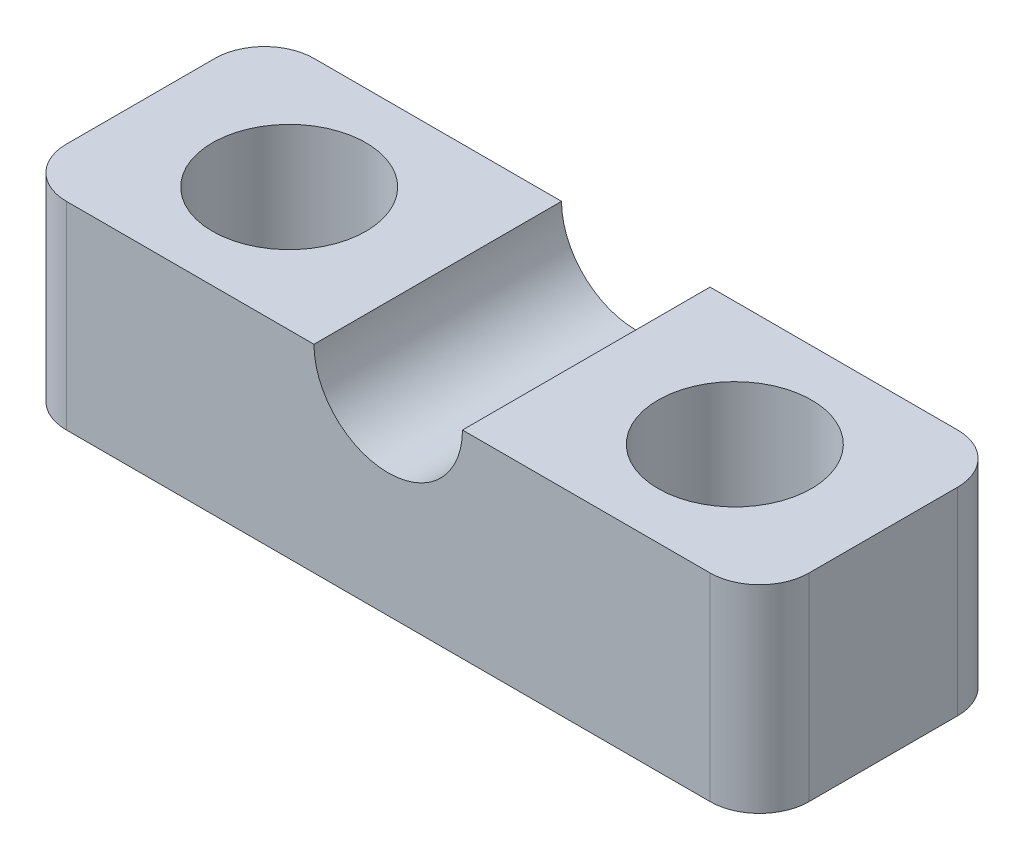
ISO-10303-21;
HEADER;
FILE_DESCRIPTION(('STEP AP214'),'2;1');
FILE_NAME('part.step','',(''),(''),'','','');
FILE_SCHEMA(('AUTOMOTIVE_DESIGN { 1 0 10303 214 1 1 1 1 }'));
ENDSEC;
DATA;
#1=APPLICATION_CONTEXT('core data for automotive mechanical design processes');
#2=APPLICATION_PROTOCOL_DEFINITION('international standard','automotive_design',2000,#1);
#3=PRODUCT_CONTEXT('',#1,'mechanical');
#4=PRODUCT('Part','Part','',(#3));
#5=PRODUCT_RELATED_PRODUCT_CATEGORY('part','',(#4));
#6=PRODUCT_DEFINITION_FORMATION('','',#4);
#7=PRODUCT_DEFINITION_CONTEXT('part definition',#1,'design');
#8=PRODUCT_DEFINITION('design','',#6,#7);
#9=PRODUCT_DEFINITION_SHAPE('','',#8);
#10=(LENGTH_UNIT() NAMED_UNIT(*) SI_UNIT(.MILLI.,.METRE.));
#11=(NAMED_UNIT(*) PLANE_ANGLE_UNIT() SI_UNIT($,.RADIAN.));
#12=(NAMED_UNIT(*) SI_UNIT($,.STERADIAN.) SOLID_ANGLE_UNIT());
#13=UNCERTAINTY_MEASURE_WITH_UNIT(LENGTH_MEASURE(1.E-05),#10,'distance_accuracy_value','');
#14=(GEOMETRIC_REPRESENTATION_CONTEXT(3) GLOBAL_UNCERTAINTY_ASSIGNED_CONTEXT((#13)) GLOBAL_UNIT_ASSIGNED_CONTEXT((#10,
#11,#12)) REPRESENTATION_CONTEXT('',''));
#15=CARTESIAN_POINT('',(0.,0.,0.));
#16=DIRECTION('',(0.,0.,1.));
#17=DIRECTION('',(1.,0.,0.));
#18=AXIS2_PLACEMENT_3D('',#15,#16,#17);
#19=CARTESIAN_POINT('',(0.,4.,0.));
#20=DIRECTION('',(0.,-1.,0.));
#21=DIRECTION('',(0.,0.,-1.));
#22=AXIS2_PLACEMENT_3D('',#19,#20,#21);
#23=PLANE('',#22);
#24=CARTESIAN_POINT('',(-1.64788732394367,4.,-0.352112676056339));
#25=DIRECTION('',(0.,1.,0.));
#26=DIRECTION('',(0.,0.,1.));
#27=AXIS2_PLACEMENT_3D('',#24,#25,#26);
#28=CIRCLE('',#27,1.55);
#29=CARTESIAN_POINT('',(-1.64788732394367,4.,1.19788732394366));
#30=VERTEX_POINT('',#29);
#31=EDGE_CURVE('E156',#30,#30,#28,.T.);
#32=ORIENTED_EDGE('',*,*,#31,.F.);
#33=EDGE_LOOP('',(#32));
#34=FACE_BOUND('',#33,.T.);
#35=DIRECTION('',(0.,0.,1.));
#36=VECTOR('',#35,1.);
#37=CARTESIAN_POINT('',(-4.64788732394367,4.,2.14788732394366));
#38=LINE('',#37,#36);
#39=CARTESIAN_POINT('',(-4.64788732394367,4.,-1.85211267605634));
#40=VERTEX_POINT('',#39);
#41=CARTESIAN_POINT('',(-4.64788732394367,4.,1.14788732394366));
#42=VERTEX_POINT('',#41);
#43=EDGE_CURVE('E162',#40,#42,#38,.T.);
#44=ORIENTED_EDGE('',*,*,#43,.T.);
#45=CARTESIAN_POINT('',(-3.64788732394367,4.,1.14788732394366));
#46=DIRECTION('',(0.,-1.,0.));
#47=DIRECTION('',(0.,0.,-1.));
#48=AXIS2_PLACEMENT_3D('',#45,#46,#47);
#49=CIRCLE('',#48,1.);
#50=CARTESIAN_POINT('',(-3.64788732394367,4.,2.14788732394366));
#51=VERTEX_POINT('',#50);
#52=EDGE_CURVE('E125',#42,#51,#49,.F.);
#53=ORIENTED_EDGE('',*,*,#52,.T.);
#54=DIRECTION('',(1.,0.,0.));
#55=VECTOR('',#54,1.);
#56=CARTESIAN_POINT('',(-4.64788732394367,4.,2.14788732394366));
#57=LINE('',#56,#55);
#58=CARTESIAN_POINT('',(1.35211267605633,4.,2.14788732394366));
#59=VERTEX_POINT('',#58);
#60=EDGE_CURVE('E118',#51,#59,#57,.T.);
#61=ORIENTED_EDGE('',*,*,#60,.T.);
#62=DIRECTION('',(0.,0.,-1.));
#63=VECTOR('',#62,1.);
#64=CARTESIAN_POINT('',(1.35211267605633,4.,2.14788732394366));
#65=LINE('',#64,#63);
#66=CARTESIAN_POINT('',(1.35211267605633,4.,-2.85211267605634));
#67=VERTEX_POINT('',#66);
#68=EDGE_CURVE('E122',#59,#67,#65,.T.);
#69=ORIENTED_EDGE('',*,*,#68,.T.);
#70=DIRECTION('',(-1.,0.,0.));
#71=VECTOR('',#70,1.);
#72=CARTESIAN_POINT('',(-4.64788732394367,4.,-2.85211267605634));
#73=LINE('',#72,#71);
#74=CARTESIAN_POINT('',(-3.64788732394367,4.,-2.85211267605634));
#75=VERTEX_POINT('',#74);
#76=EDGE_CURVE('E168',#67,#75,#73,.T.);
#77=ORIENTED_EDGE('',*,*,#76,.T.);
#78=CARTESIAN_POINT('',(-3.64788732394367,4.,-1.85211267605634));
#79=DIRECTION('',(0.,-1.,0.));
#80=DIRECTION('',(0.,0.,-1.));
#81=AXIS2_PLACEMENT_3D('',#78,#79,#80);
#82=CIRCLE('',#81,1.);
#83=EDGE_CURVE('E211',#75,#40,#82,.F.);
#84=ORIENTED_EDGE('',*,*,#83,.T.);
#85=EDGE_LOOP('',(#44,#53,#61,#69,#77,#84));
#86=FACE_BOUND('',#85,.T.);
#87=ADVANCED_FACE('F39',(#34,#86),#23,.F.);
#88=CARTESIAN_POINT('',(-4.64788732394367,4.,2.14788732394366));
#89=DIRECTION('',(1.,0.,0.));
#90=DIRECTION('',(0.,0.,-1.));
#91=AXIS2_PLACEMENT_3D('',#88,#89,#90);
#92=PLANE('',#91);
#93=DIRECTION('',(0.,0.,1.));
#94=VECTOR('',#93,1.);
#95=CARTESIAN_POINT('',(-4.64788732394367,0.,2.14788732394366));
#96=LINE('',#95,#94);
#97=CARTESIAN_POINT('',(-4.64788732394367,0.,-1.85211267605634));
#98=VERTEX_POINT('',#97);
#99=CARTESIAN_POINT('',(-4.64788732394367,0.,1.14788732394366));
#100=VERTEX_POINT('',#99);
#101=EDGE_CURVE('E153',#98,#100,#96,.T.);
#102=ORIENTED_EDGE('',*,*,#101,.T.);
#103=DIRECTION('',(0.,-1.,0.));
#104=VECTOR('',#103,1.);
#105=CARTESIAN_POINT('',(-4.64788732394367,4.,1.14788732394366));
#106=LINE('',#105,#104);
#107=EDGE_CURVE('E208',#100,#42,#106,.F.);
#108=ORIENTED_EDGE('',*,*,#107,.T.);
#109=ORIENTED_EDGE('',*,*,#43,.F.);
#110=DIRECTION('',(0.,-1.,0.));
#111=VECTOR('',#110,1.);
#112=CARTESIAN_POINT('',(-4.64788732394367,4.,-1.85211267605634));
#113=LINE('',#112,#111);
#114=EDGE_CURVE('E204',#40,#98,#113,.T.);
#115=ORIENTED_EDGE('',*,*,#114,.T.);
#116=EDGE_LOOP('',(#102,#108,#109,#115));
#117=FACE_BOUND('',#116,.T.);
#118=ADVANCED_FACE('F245',(#117),#92,.F.);
#119=CARTESIAN_POINT('',(-4.64788732394367,4.,2.14788732394366));
#120=DIRECTION('',(0.,0.,-1.));
#121=DIRECTION('',(-1.,0.,0.));
#122=AXIS2_PLACEMENT_3D('',#119,#120,#121);
#123=PLANE('',#122);
#124=ORIENTED_EDGE('',*,*,#60,.F.);
#125=DIRECTION('',(0.,-1.,0.));
#126=VECTOR('',#125,1.);
#127=CARTESIAN_POINT('',(-3.64788732394367,4.,2.14788732394366));
#128=LINE('',#127,#126);
#129=CARTESIAN_POINT('',(-3.64788732394367,0.,2.14788732394366));
#130=VERTEX_POINT('',#129);
#131=EDGE_CURVE('E189',#51,#130,#128,.T.);
#132=ORIENTED_EDGE('',*,*,#131,.T.);
#133=DIRECTION('',(1.,0.,0.));
#134=VECTOR('',#133,1.);
#135=CARTESIAN_POINT('',(-4.64788732394367,0.,2.14788732394366));
#136=LINE('',#135,#134);
#137=CARTESIAN_POINT('',(9.35211267605633,0.,2.14788732394366));
#138=VERTEX_POINT('',#137);
#139=EDGE_CURVE('E175',#130,#138,#136,.T.);
#140=ORIENTED_EDGE('',*,*,#139,.T.);
#141=DIRECTION('',(0.,-1.,0.));
#142=VECTOR('',#141,1.);
#143=CARTESIAN_POINT('',(9.35211267605633,4.,2.14788732394366));
#144=LINE('',#143,#142);
#145=CARTESIAN_POINT('',(9.35211267605633,4.,2.14788732394366));
#146=VERTEX_POINT('',#145);
#147=EDGE_CURVE('E142',#138,#146,#144,.F.);
#148=ORIENTED_EDGE('',*,*,#147,.T.);
#149=CARTESIAN_POINT('',(4.35211267605633,4.,2.14788732394366));
#150=VERTEX_POINT('',#149);
#151=EDGE_CURVE('E132',#150,#146,#57,.T.);
#152=ORIENTED_EDGE('',*,*,#151,.F.);
#153=CARTESIAN_POINT('',(2.85211267605633,4.,2.14788732394366));
#154=DIRECTION('',(0.,0.,-1.));
#155=DIRECTION('',(-1.,0.,0.));
#156=AXIS2_PLACEMENT_3D('',#153,#154,#155);
#157=CIRCLE('',#156,1.5);
#158=EDGE_CURVE('E137',#150,#59,#157,.T.);
#159=ORIENTED_EDGE('',*,*,#158,.T.);
#160=EDGE_LOOP('',(#124,#132,#140,#148,#152,#159));
#161=FACE_BOUND('',#160,.T.);
#162=ADVANCED_FACE('F146',(#161),#123,.F.);
#163=CARTESIAN_POINT('',(10.3521126760563,4.,2.14788732394366));
#164=DIRECTION('',(-1.,0.,0.));
#165=DIRECTION('',(0.,0.,1.));
#166=AXIS2_PLACEMENT_3D('',#163,#164,#165);
#167=PLANE('',#166);
#168=DIRECTION('',(0.,0.,-1.));
#169=VECTOR('',#168,1.);
#170=CARTESIAN_POINT('',(10.3521126760563,4.,2.14788732394366));
#171=LINE('',#170,#169);
#172=CARTESIAN_POINT('',(10.3521126760563,4.,1.14788732394366));
#173=VERTEX_POINT('',#172);
#174=CARTESIAN_POINT('',(10.3521126760563,4.,-1.85211267605634));
#175=VERTEX_POINT('',#174);
#176=EDGE_CURVE('E131',#173,#175,#171,.T.);
#177=ORIENTED_EDGE('',*,*,#176,.F.);
#178=DIRECTION('',(0.,-1.,0.));
#179=VECTOR('',#178,1.);
#180=CARTESIAN_POINT('',(10.3521126760563,4.,1.14788732394366));
#181=LINE('',#180,#179);
#182=CARTESIAN_POINT('',(10.3521126760563,0.,1.14788732394366));
#183=VERTEX_POINT('',#182);
#184=EDGE_CURVE('E218',#173,#183,#181,.T.);
#185=ORIENTED_EDGE('',*,*,#184,.T.);
#186=DIRECTION('',(0.,0.,-1.));
#187=VECTOR('',#186,1.);
#188=CARTESIAN_POINT('',(10.3521126760563,0.,2.14788732394366));
#189=LINE('',#188,#187);
#190=CARTESIAN_POINT('',(10.3521126760563,0.,-1.85211267605634));
#191=VERTEX_POINT('',#190);
#192=EDGE_CURVE('E179',#183,#191,#189,.T.);
#193=ORIENTED_EDGE('',*,*,#192,.T.);
#194=DIRECTION('',(0.,-1.,0.));
#195=VECTOR('',#194,1.);
#196=CARTESIAN_POINT('',(10.3521126760563,4.,-1.85211267605634));
#197=LINE('',#196,#195);
#198=EDGE_CURVE('E63',#191,#175,#197,.F.);
#199=ORIENTED_EDGE('',*,*,#198,.T.);
#200=EDGE_LOOP('',(#177,#185,#193,#199));
#201=FACE_BOUND('',#200,.T.);
#202=ADVANCED_FACE('F254',(#201),#167,.F.);
#203=CARTESIAN_POINT('',(-4.64788732394367,4.,-2.85211267605634));
#204=DIRECTION('',(0.,0.,1.));
#205=DIRECTION('',(1.,0.,0.));
#206=AXIS2_PLACEMENT_3D('',#203,#204,#205);
#207=PLANE('',#206);
#208=DIRECTION('',(-1.,0.,0.));
#209=VECTOR('',#208,1.);
#210=CARTESIAN_POINT('',(-4.64788732394367,0.,-2.85211267605634));
#211=LINE('',#210,#209);
#212=CARTESIAN_POINT('',(9.35211267605633,0.,-2.85211267605634));
#213=VERTEX_POINT('',#212);
#214=CARTESIAN_POINT('',(-3.64788732394367,0.,-2.85211267605634));
#215=VERTEX_POINT('',#214);
#216=EDGE_CURVE('E164',#213,#215,#211,.T.);
#217=ORIENTED_EDGE('',*,*,#216,.T.);
#218=DIRECTION('',(0.,-1.,0.));
#219=VECTOR('',#218,1.);
#220=CARTESIAN_POINT('',(-3.64788732394367,4.,-2.85211267605634));
#221=LINE('',#220,#219);
#222=EDGE_CURVE('E11',#215,#75,#221,.F.);
#223=ORIENTED_EDGE('',*,*,#222,.T.);
#224=ORIENTED_EDGE('',*,*,#76,.F.);
#225=CARTESIAN_POINT('',(2.85211267605633,4.,-2.85211267605634));
#226=DIRECTION('',(0.,0.,1.));
#227=DIRECTION('',(1.,0.,0.));
#228=AXIS2_PLACEMENT_3D('',#225,#226,#227);
#229=CIRCLE('',#228,1.5);
#230=CARTESIAN_POINT('',(4.35211267605633,4.,-2.85211267605634));
#231=VERTEX_POINT('',#230);
#232=EDGE_CURVE('E140',#67,#231,#229,.T.);
#233=ORIENTED_EDGE('',*,*,#232,.T.);
#234=CARTESIAN_POINT('',(9.35211267605633,4.,-2.85211267605634));
#235=VERTEX_POINT('',#234);
#236=EDGE_CURVE('E169',#235,#231,#73,.T.);
#237=ORIENTED_EDGE('',*,*,#236,.F.);
#238=DIRECTION('',(0.,-1.,0.));
#239=VECTOR('',#238,1.);
#240=CARTESIAN_POINT('',(9.35211267605633,4.,-2.85211267605634));
#241=LINE('',#240,#239);
#242=EDGE_CURVE('E48',#235,#213,#241,.T.);
#243=ORIENTED_EDGE('',*,*,#242,.T.);
#244=EDGE_LOOP('',(#217,#223,#224,#233,#237,#243));
#245=FACE_BOUND('',#244,.T.);
#246=ADVANCED_FACE('F231',(#245),#207,.F.);
#247=CARTESIAN_POINT('',(7.35211267605633,4.,-0.352112676056339));
#248=DIRECTION('',(0.,1.,0.));
#249=DIRECTION('',(0.,0.,1.));
#250=AXIS2_PLACEMENT_3D('',#247,#248,#249);
#251=CIRCLE('',#250,1.55);
#252=CARTESIAN_POINT('',(7.35211267605633,4.,1.19788732394366));
#253=VERTEX_POINT('',#252);
#254=EDGE_CURVE('E159',#253,#253,#251,.T.);
#255=ORIENTED_EDGE('',*,*,#254,.F.);
#256=EDGE_LOOP('',(#255));
#257=FACE_BOUND('',#256,.T.);
#258=ORIENTED_EDGE('',*,*,#151,.T.);
#259=CARTESIAN_POINT('',(9.35211267605633,4.,1.14788732394366));
#260=DIRECTION('',(0.,-1.,0.));
#261=DIRECTION('',(0.,0.,-1.));
#262=AXIS2_PLACEMENT_3D('',#259,#260,#261);
#263=CIRCLE('',#262,1.);
#264=EDGE_CURVE('E224',#146,#173,#263,.F.);
#265=ORIENTED_EDGE('',*,*,#264,.T.);
#266=ORIENTED_EDGE('',*,*,#176,.T.);
#267=CARTESIAN_POINT('',(9.35211267605633,4.,-1.85211267605634));
#268=DIRECTION('',(0.,-1.,0.));
#269=DIRECTION('',(0.,0.,-1.));
#270=AXIS2_PLACEMENT_3D('',#267,#268,#269);
#271=CIRCLE('',#270,1.);
#272=EDGE_CURVE('E55',#175,#235,#271,.F.);
#273=ORIENTED_EDGE('',*,*,#272,.T.);
#274=ORIENTED_EDGE('',*,*,#236,.T.);
#275=DIRECTION('',(0.,0.,-1.));
#276=VECTOR('',#275,1.);
#277=CARTESIAN_POINT('',(4.35211267605633,4.,2.14788732394366));
#278=LINE('',#277,#276);
#279=EDGE_CURVE('E143',#231,#150,#278,.F.);
#280=ORIENTED_EDGE('',*,*,#279,.T.);
#281=EDGE_LOOP('',(#258,#265,#266,#273,#274,#280));
#282=FACE_BOUND('',#281,.T.);
#283=ADVANCED_FACE('F255',(#257,#282),#23,.F.);
#284=CARTESIAN_POINT('',(0.,0.,0.));
#285=DIRECTION('',(0.,-1.,0.));
#286=DIRECTION('',(0.,0.,-1.));
#287=AXIS2_PLACEMENT_3D('',#284,#285,#286);
#288=PLANE('',#287);
#289=CARTESIAN_POINT('',(-1.64788732394367,0.,-0.352112676056339));
#290=DIRECTION('',(0.,1.,0.));
#291=DIRECTION('',(0.,0.,1.));
#292=AXIS2_PLACEMENT_3D('',#289,#290,#291);
#293=CIRCLE('',#292,1.55);
#294=CARTESIAN_POINT('',(-1.64788732394367,0.,1.19788732394366));
#295=VERTEX_POINT('',#294);
#296=EDGE_CURVE('E149',#295,#295,#293,.T.);
#297=ORIENTED_EDGE('',*,*,#296,.T.);
#298=EDGE_LOOP('',(#297));
#299=FACE_BOUND('',#298,.T.);
#300=CARTESIAN_POINT('',(7.35211267605633,0.,-0.352112676056339));
#301=DIRECTION('',(0.,1.,0.));
#302=DIRECTION('',(0.,0.,1.));
#303=AXIS2_PLACEMENT_3D('',#300,#301,#302);
#304=CIRCLE('',#303,1.55);
#305=CARTESIAN_POINT('',(7.35211267605633,0.,1.19788732394366));
#306=VERTEX_POINT('',#305);
#307=EDGE_CURVE('E282',#306,#306,#304,.T.);
#308=ORIENTED_EDGE('',*,*,#307,.T.);
#309=EDGE_LOOP('',(#308));
#310=FACE_BOUND('',#309,.T.);
#311=ORIENTED_EDGE('',*,*,#139,.F.);
#312=CARTESIAN_POINT('',(-3.64788732394367,0.,1.14788732394366));
#313=DIRECTION('',(0.,-1.,0.));
#314=DIRECTION('',(0.,0.,-1.));
#315=AXIS2_PLACEMENT_3D('',#312,#313,#314);
#316=CIRCLE('',#315,1.);
#317=EDGE_CURVE('E201',#130,#100,#316,.T.);
#318=ORIENTED_EDGE('',*,*,#317,.T.);
#319=ORIENTED_EDGE('',*,*,#101,.F.);
#320=CARTESIAN_POINT('',(-3.64788732394367,0.,-1.85211267605634));
#321=DIRECTION('',(0.,-1.,0.));
#322=DIRECTION('',(0.,0.,-1.));
#323=AXIS2_PLACEMENT_3D('',#320,#321,#322);
#324=CIRCLE('',#323,1.);
#325=EDGE_CURVE('E195',#98,#215,#324,.T.);
#326=ORIENTED_EDGE('',*,*,#325,.T.);
#327=ORIENTED_EDGE('',*,*,#216,.F.);
#328=CARTESIAN_POINT('',(9.35211267605633,0.,-1.85211267605634));
#329=DIRECTION('',(0.,-1.,0.));
#330=DIRECTION('',(0.,0.,-1.));
#331=AXIS2_PLACEMENT_3D('',#328,#329,#330);
#332=CIRCLE('',#331,1.);
#333=EDGE_CURVE('E192',#213,#191,#332,.T.);
#334=ORIENTED_EDGE('',*,*,#333,.T.);
#335=ORIENTED_EDGE('',*,*,#192,.F.);
#336=CARTESIAN_POINT('',(9.35211267605633,0.,1.14788732394366));
#337=DIRECTION('',(0.,-1.,0.));
#338=DIRECTION('',(0.,0.,-1.));
#339=AXIS2_PLACEMENT_3D('',#336,#337,#338);
#340=CIRCLE('',#339,1.);
#341=EDGE_CURVE('E198',#183,#138,#340,.T.);
#342=ORIENTED_EDGE('',*,*,#341,.T.);
#343=EDGE_LOOP('',(#311,#318,#319,#326,#327,#334,#335,#342));
#344=FACE_BOUND('',#343,.T.);
#345=ADVANCED_FACE('F236',(#299,#310,#344),#288,.T.);
#346=CARTESIAN_POINT('',(2.85211267605633,4.,2.14788732394366));
#347=DIRECTION('',(0.,0.,-1.));
#348=DIRECTION('',(-1.,0.,0.));
#349=AXIS2_PLACEMENT_3D('',#346,#347,#348);
#350=CYLINDRICAL_SURFACE('',#349,1.5);
#351=ORIENTED_EDGE('',*,*,#158,.F.);
#352=ORIENTED_EDGE('',*,*,#279,.F.);
#353=ORIENTED_EDGE('',*,*,#232,.F.);
#354=ORIENTED_EDGE('',*,*,#68,.F.);
#355=EDGE_LOOP('',(#351,#352,#353,#354));
#356=FACE_BOUND('',#355,.T.);
#357=ADVANCED_FACE('F135',(#356),#350,.F.);
#358=CARTESIAN_POINT('',(7.35211267605633,0.,-0.352112676056339));
#359=DIRECTION('',(0.,1.,0.));
#360=DIRECTION('',(0.,0.,1.));
#361=AXIS2_PLACEMENT_3D('',#358,#359,#360);
#362=CYLINDRICAL_SURFACE('',#361,1.55);
#363=ORIENTED_EDGE('',*,*,#307,.F.);
#364=EDGE_LOOP('',(#363));
#365=FACE_BOUND('',#364,.T.);
#366=ORIENTED_EDGE('',*,*,#254,.T.);
#367=EDGE_LOOP('',(#366));
#368=FACE_BOUND('',#367,.T.);
#369=ADVANCED_FACE('F293',(#365,#368),#362,.F.);
#370=CARTESIAN_POINT('',(-1.64788732394367,0.,-0.352112676056339));
#371=DIRECTION('',(0.,1.,0.));
#372=DIRECTION('',(0.,0.,1.));
#373=AXIS2_PLACEMENT_3D('',#370,#371,#372);
#374=CYLINDRICAL_SURFACE('',#373,1.55);
#375=ORIENTED_EDGE('',*,*,#296,.F.);
#376=EDGE_LOOP('',(#375));
#377=FACE_BOUND('',#376,.T.);
#378=ORIENTED_EDGE('',*,*,#31,.T.);
#379=EDGE_LOOP('',(#378));
#380=FACE_BOUND('',#379,.T.);
#381=ADVANCED_FACE('F291',(#377,#380),#374,.F.);
#382=CARTESIAN_POINT('',(-3.64788732394367,4.,1.14788732394366));
#383=DIRECTION('',(0.,-1.,0.));
#384=DIRECTION('',(0.,0.,-1.));
#385=AXIS2_PLACEMENT_3D('',#382,#383,#384);
#386=CYLINDRICAL_SURFACE('',#385,1.);
#387=ORIENTED_EDGE('',*,*,#52,.F.);
#388=ORIENTED_EDGE('',*,*,#107,.F.);
#389=ORIENTED_EDGE('',*,*,#317,.F.);
#390=ORIENTED_EDGE('',*,*,#131,.F.);
#391=EDGE_LOOP('',(#387,#388,#389,#390));
#392=FACE_BOUND('',#391,.T.);
#393=ADVANCED_FACE('F248',(#392),#386,.T.);
#394=CARTESIAN_POINT('',(9.35211267605633,4.,1.14788732394366));
#395=DIRECTION('',(0.,-1.,0.));
#396=DIRECTION('',(0.,0.,-1.));
#397=AXIS2_PLACEMENT_3D('',#394,#395,#396);
#398=CYLINDRICAL_SURFACE('',#397,1.);
#399=ORIENTED_EDGE('',*,*,#264,.F.);
#400=ORIENTED_EDGE('',*,*,#147,.F.);
#401=ORIENTED_EDGE('',*,*,#341,.F.);
#402=ORIENTED_EDGE('',*,*,#184,.F.);
#403=EDGE_LOOP('',(#399,#400,#401,#402));
#404=FACE_BOUND('',#403,.T.);
#405=ADVANCED_FACE('F253',(#404),#398,.T.);
#406=CARTESIAN_POINT('',(-3.64788732394367,4.,-1.85211267605634));
#407=DIRECTION('',(0.,-1.,0.));
#408=DIRECTION('',(0.,0.,-1.));
#409=AXIS2_PLACEMENT_3D('',#406,#407,#408);
#410=CYLINDRICAL_SURFACE('',#409,1.);
#411=ORIENTED_EDGE('',*,*,#83,.F.);
#412=ORIENTED_EDGE('',*,*,#222,.F.);
#413=ORIENTED_EDGE('',*,*,#325,.F.);
#414=ORIENTED_EDGE('',*,*,#114,.F.);
#415=EDGE_LOOP('',(#411,#412,#413,#414));
#416=FACE_BOUND('',#415,.T.);
#417=ADVANCED_FACE('F242',(#416),#410,.T.);
#418=CARTESIAN_POINT('',(9.35211267605633,4.,-1.85211267605634));
#419=DIRECTION('',(0.,-1.,0.));
#420=DIRECTION('',(0.,0.,-1.));
#421=AXIS2_PLACEMENT_3D('',#418,#419,#420);
#422=CYLINDRICAL_SURFACE('',#421,1.);
#423=ORIENTED_EDGE('',*,*,#272,.F.);
#424=ORIENTED_EDGE('',*,*,#198,.F.);
#425=ORIENTED_EDGE('',*,*,#333,.F.);
#426=ORIENTED_EDGE('',*,*,#242,.F.);
#427=EDGE_LOOP('',(#423,#424,#425,#426));
#428=FACE_BOUND('',#427,.T.);
#429=ADVANCED_FACE('F41',(#428),#422,.T.);
#430=CLOSED_SHELL('',(#87,#118,#162,#202,#246,#283,#345,#357,#369,#381,#393,#405,#417,#429));
#431=MANIFOLD_SOLID_BREP('B2',#430);
#432=ADVANCED_BREP_SHAPE_REPRESENTATION('',(#18,#431),#14);
#433=SHAPE_DEFINITION_REPRESENTATION(#9,#432);
ENDSEC;
END-ISO-10303-21;
